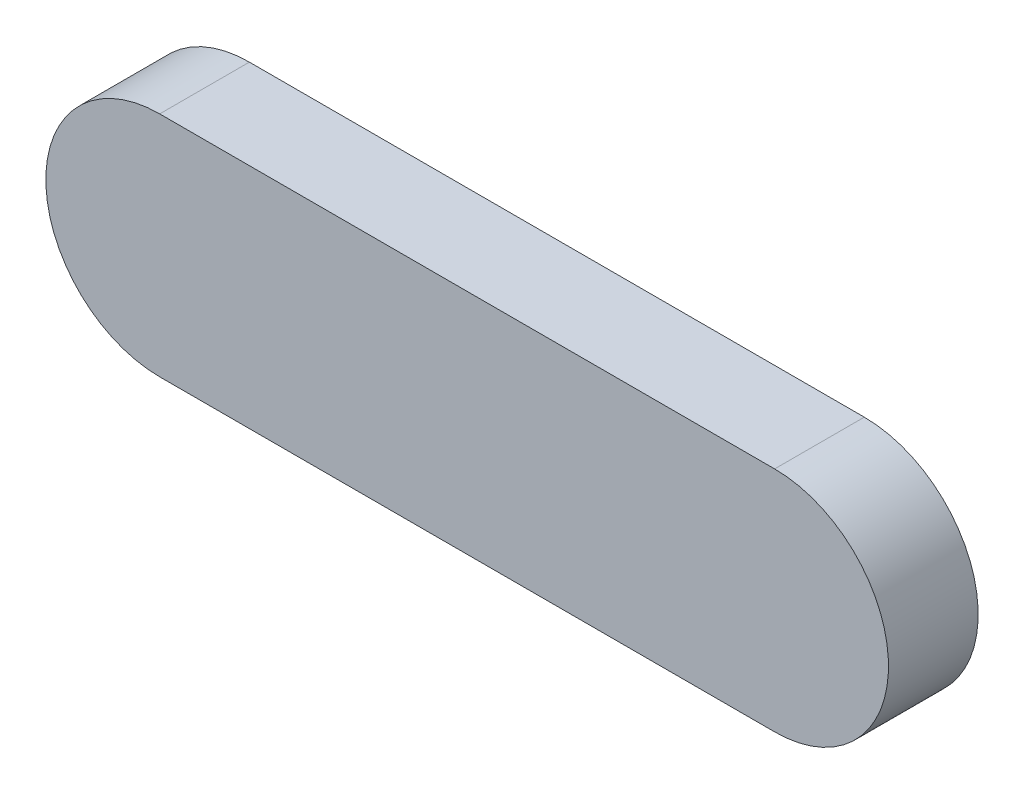
ISO-10303-21;
HEADER;
FILE_DESCRIPTION(('STEP AP214'),'2;1');
FILE_NAME('part.step','',(''),(''),'','','');
FILE_SCHEMA(('AUTOMOTIVE_DESIGN { 1 0 10303 214 1 1 1 1 }'));
ENDSEC;
DATA;
#1=APPLICATION_CONTEXT('core data for automotive mechanical design processes');
#2=APPLICATION_PROTOCOL_DEFINITION('international standard','automotive_design',2000,#1);
#3=PRODUCT_CONTEXT('',#1,'mechanical');
#4=PRODUCT('Part','Part','',(#3));
#5=PRODUCT_RELATED_PRODUCT_CATEGORY('part','',(#4));
#6=PRODUCT_DEFINITION_FORMATION('','',#4);
#7=PRODUCT_DEFINITION_CONTEXT('part definition',#1,'design');
#8=PRODUCT_DEFINITION('design','',#6,#7);
#9=PRODUCT_DEFINITION_SHAPE('','',#8);
#10=(LENGTH_UNIT() NAMED_UNIT(*) SI_UNIT(.MILLI.,.METRE.));
#11=(NAMED_UNIT(*) PLANE_ANGLE_UNIT() SI_UNIT($,.RADIAN.));
#12=(NAMED_UNIT(*) SI_UNIT($,.STERADIAN.) SOLID_ANGLE_UNIT());
#13=UNCERTAINTY_MEASURE_WITH_UNIT(LENGTH_MEASURE(1.E-05),#10,'distance_accuracy_value','');
#14=(GEOMETRIC_REPRESENTATION_CONTEXT(3) GLOBAL_UNCERTAINTY_ASSIGNED_CONTEXT((#13)) GLOBAL_UNIT_ASSIGNED_CONTEXT((#10,
#11,#12)) REPRESENTATION_CONTEXT('',''));
#15=CARTESIAN_POINT('',(0.,0.,0.));
#16=DIRECTION('',(0.,0.,1.));
#17=DIRECTION('',(1.,0.,0.));
#18=AXIS2_PLACEMENT_3D('',#15,#16,#17);
#19=CARTESIAN_POINT('',(149.8346,113.3602,0.));
#20=DIRECTION('',(0.,1.,0.));
#21=DIRECTION('',(1.,0.,0.));
#22=AXIS2_PLACEMENT_3D('',#19,#20,#21);
#23=PLANE('',#22);
#24=DIRECTION('',(1.,0.,0.));
#25=VECTOR('',#24,1.);
#26=CARTESIAN_POINT('',(149.8346,113.3602,0.1999996));
#27=LINE('',#26,#25);
#28=CARTESIAN_POINT('',(149.8346,113.3602,0.1999996));
#29=VERTEX_POINT('',#28);
#30=CARTESIAN_POINT('',(151.2062,113.3602,0.1999996));
#31=VERTEX_POINT('',#30);
#32=EDGE_CURVE('E11',#29,#31,#27,.T.);
#33=ORIENTED_EDGE('',*,*,#32,.F.);
#34=DIRECTION('',(0.,0.,1.));
#35=VECTOR('',#34,1.);
#36=CARTESIAN_POINT('',(149.8346,113.3602,0.));
#37=LINE('',#36,#35);
#38=CARTESIAN_POINT('',(149.8346,113.3602,0.));
#39=VERTEX_POINT('',#38);
#40=EDGE_CURVE('E24',#39,#29,#37,.T.);
#41=ORIENTED_EDGE('',*,*,#40,.F.);
#42=DIRECTION('',(1.,0.,0.));
#43=VECTOR('',#42,1.);
#44=CARTESIAN_POINT('',(149.8346,113.3602,0.));
#45=LINE('',#44,#43);
#46=CARTESIAN_POINT('',(151.2062,113.3602,0.));
#47=VERTEX_POINT('',#46);
#48=EDGE_CURVE('E75',#39,#47,#45,.T.);
#49=ORIENTED_EDGE('',*,*,#48,.T.);
#50=DIRECTION('',(0.,0.,1.));
#51=VECTOR('',#50,1.);
#52=CARTESIAN_POINT('',(151.2062,113.3602,0.));
#53=LINE('',#52,#51);
#54=EDGE_CURVE('E37',#47,#31,#53,.T.);
#55=ORIENTED_EDGE('',*,*,#54,.T.);
#56=EDGE_LOOP('',(#33,#41,#49,#55));
#57=FACE_BOUND('',#56,.T.);
#58=ADVANCED_FACE('F17',(#57),#23,.F.);
#59=CARTESIAN_POINT('',(151.2062,113.6142,0.));
#60=DIRECTION('',(0.,0.,-1.));
#61=DIRECTION('',(1.11896493820486E-13,-1.,0.));
#62=AXIS2_PLACEMENT_3D('',#59,#60,#61);
#63=CYLINDRICAL_SURFACE('',#62,0.254000000000005);
#64=CARTESIAN_POINT('',(151.2062,113.6142,0.1999996));
#65=DIRECTION('',(0.,0.,1.));
#66=DIRECTION('',(1.11896493820486E-13,-1.,0.));
#67=AXIS2_PLACEMENT_3D('',#64,#65,#66);
#68=CIRCLE('',#67,0.254000000000005);
#69=CARTESIAN_POINT('',(151.2062,113.8682,0.1999996));
#70=VERTEX_POINT('',#69);
#71=EDGE_CURVE('E83',#31,#70,#68,.T.);
#72=ORIENTED_EDGE('',*,*,#71,.F.);
#73=ORIENTED_EDGE('',*,*,#54,.F.);
#74=CARTESIAN_POINT('',(151.2062,113.6142,0.));
#75=DIRECTION('',(0.,0.,1.));
#76=DIRECTION('',(1.11896493820486E-13,-1.,0.));
#77=AXIS2_PLACEMENT_3D('',#74,#75,#76);
#78=CIRCLE('',#77,0.254000000000005);
#79=CARTESIAN_POINT('',(151.2062,113.8682,0.));
#80=VERTEX_POINT('',#79);
#81=EDGE_CURVE('E81',#47,#80,#78,.T.);
#82=ORIENTED_EDGE('',*,*,#81,.T.);
#83=DIRECTION('',(0.,0.,1.));
#84=VECTOR('',#83,1.);
#85=CARTESIAN_POINT('',(151.2062,113.8682,0.));
#86=LINE('',#85,#84);
#87=EDGE_CURVE('E67',#80,#70,#86,.T.);
#88=ORIENTED_EDGE('',*,*,#87,.T.);
#89=EDGE_LOOP('',(#72,#73,#82,#88));
#90=FACE_BOUND('',#89,.T.);
#91=ADVANCED_FACE('F89',(#90),#63,.T.);
#92=CARTESIAN_POINT('',(151.2062,113.8682,0.));
#93=DIRECTION('',(0.,-1.,0.));
#94=DIRECTION('',(-1.,0.,0.));
#95=AXIS2_PLACEMENT_3D('',#92,#93,#94);
#96=PLANE('',#95);
#97=DIRECTION('',(-1.,0.,0.));
#98=VECTOR('',#97,1.);
#99=CARTESIAN_POINT('',(151.2062,113.8682,0.1999996));
#100=LINE('',#99,#98);
#101=CARTESIAN_POINT('',(149.8346,113.8682,0.1999996));
#102=VERTEX_POINT('',#101);
#103=EDGE_CURVE('E71',#70,#102,#100,.T.);
#104=ORIENTED_EDGE('',*,*,#103,.F.);
#105=ORIENTED_EDGE('',*,*,#87,.F.);
#106=DIRECTION('',(-1.,0.,0.));
#107=VECTOR('',#106,1.);
#108=CARTESIAN_POINT('',(151.2062,113.8682,0.));
#109=LINE('',#108,#107);
#110=CARTESIAN_POINT('',(149.8346,113.8682,0.));
#111=VERTEX_POINT('',#110);
#112=EDGE_CURVE('E63',#80,#111,#109,.T.);
#113=ORIENTED_EDGE('',*,*,#112,.T.);
#114=DIRECTION('',(0.,0.,1.));
#115=VECTOR('',#114,1.);
#116=CARTESIAN_POINT('',(149.8346,113.8682,0.));
#117=LINE('',#116,#115);
#118=EDGE_CURVE('E53',#111,#102,#117,.T.);
#119=ORIENTED_EDGE('',*,*,#118,.T.);
#120=EDGE_LOOP('',(#104,#105,#113,#119));
#121=FACE_BOUND('',#120,.T.);
#122=ADVANCED_FACE('F66',(#121),#96,.F.);
#123=CARTESIAN_POINT('',(149.8346,113.6142,0.));
#124=DIRECTION('',(0.,0.,-1.));
#125=DIRECTION('',(-1.11896493820486E-13,1.,0.));
#126=AXIS2_PLACEMENT_3D('',#123,#124,#125);
#127=CYLINDRICAL_SURFACE('',#126,0.254000000000005);
#128=CARTESIAN_POINT('',(149.8346,113.6142,0.1999996));
#129=DIRECTION('',(0.,0.,1.));
#130=DIRECTION('',(-1.11896493820486E-13,1.,0.));
#131=AXIS2_PLACEMENT_3D('',#128,#129,#130);
#132=CIRCLE('',#131,0.254000000000005);
#133=EDGE_CURVE('E59',#102,#29,#132,.T.);
#134=ORIENTED_EDGE('',*,*,#133,.F.);
#135=ORIENTED_EDGE('',*,*,#118,.F.);
#136=CARTESIAN_POINT('',(149.8346,113.6142,0.));
#137=DIRECTION('',(0.,0.,1.));
#138=DIRECTION('',(-1.11896493820486E-13,1.,0.));
#139=AXIS2_PLACEMENT_3D('',#136,#137,#138);
#140=CIRCLE('',#139,0.254000000000005);
#141=EDGE_CURVE('E57',#111,#39,#140,.T.);
#142=ORIENTED_EDGE('',*,*,#141,.T.);
#143=ORIENTED_EDGE('',*,*,#40,.T.);
#144=EDGE_LOOP('',(#134,#135,#142,#143));
#145=FACE_BOUND('',#144,.T.);
#146=ADVANCED_FACE('F55',(#145),#127,.T.);
#147=CARTESIAN_POINT('',(149.8346,113.3602,0.));
#148=DIRECTION('',(0.,0.,-1.));
#149=DIRECTION('',(-1.,0.,0.));
#150=AXIS2_PLACEMENT_3D('',#147,#148,#149);
#151=PLANE('',#150);
#152=ORIENTED_EDGE('',*,*,#141,.F.);
#153=ORIENTED_EDGE('',*,*,#112,.F.);
#154=ORIENTED_EDGE('',*,*,#81,.F.);
#155=ORIENTED_EDGE('',*,*,#48,.F.);
#156=EDGE_LOOP('',(#152,#153,#154,#155));
#157=FACE_BOUND('',#156,.T.);
#158=ADVANCED_FACE('F74',(#157),#151,.T.);
#159=CARTESIAN_POINT('',(149.8346,113.3602,0.1999996));
#160=DIRECTION('',(0.,0.,-1.));
#161=DIRECTION('',(-1.,0.,0.));
#162=AXIS2_PLACEMENT_3D('',#159,#160,#161);
#163=PLANE('',#162);
#164=ORIENTED_EDGE('',*,*,#32,.T.);
#165=ORIENTED_EDGE('',*,*,#71,.T.);
#166=ORIENTED_EDGE('',*,*,#103,.T.);
#167=ORIENTED_EDGE('',*,*,#133,.T.);
#168=EDGE_LOOP('',(#164,#165,#166,#167));
#169=FACE_BOUND('',#168,.T.);
#170=ADVANCED_FACE('F91',(#169),#163,.F.);
#171=CLOSED_SHELL('',(#58,#91,#122,#146,#158,#170));
#172=MANIFOLD_SOLID_BREP('B1',#171);
#173=ADVANCED_BREP_SHAPE_REPRESENTATION('',(#18,#172),#14);
#174=SHAPE_DEFINITION_REPRESENTATION(#9,#173);
ENDSEC;
END-ISO-10303-21;
